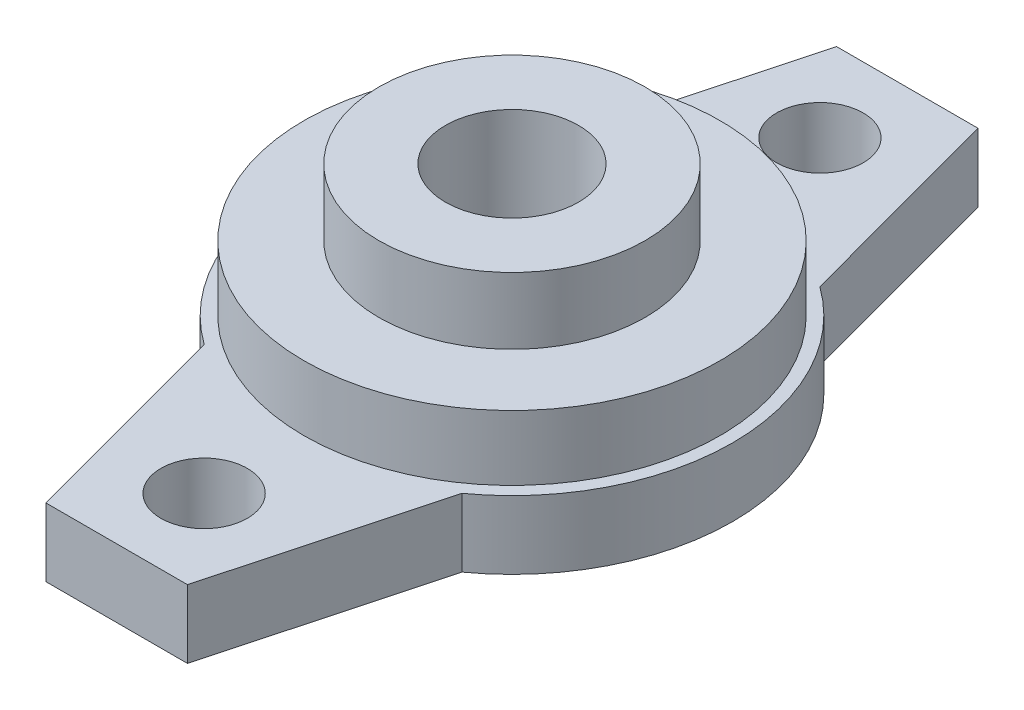
ISO-10303-21;
HEADER;
FILE_DESCRIPTION(('STEP AP214'),'2;1');
FILE_NAME('part.step','',(''),(''),'','','');
FILE_SCHEMA(('AUTOMOTIVE_DESIGN { 1 0 10303 214 1 1 1 1 }'));
ENDSEC;
DATA;
#1=APPLICATION_CONTEXT('core data for automotive mechanical design processes');
#2=APPLICATION_PROTOCOL_DEFINITION('international standard','automotive_design',2000,#1);
#3=PRODUCT_CONTEXT('',#1,'mechanical');
#4=PRODUCT('Part','Part','',(#3));
#5=PRODUCT_RELATED_PRODUCT_CATEGORY('part','',(#4));
#6=PRODUCT_DEFINITION_FORMATION('','',#4);
#7=PRODUCT_DEFINITION_CONTEXT('part definition',#1,'design');
#8=PRODUCT_DEFINITION('design','',#6,#7);
#9=PRODUCT_DEFINITION_SHAPE('','',#8);
#10=(LENGTH_UNIT() NAMED_UNIT(*) SI_UNIT(.MILLI.,.METRE.));
#11=(NAMED_UNIT(*) PLANE_ANGLE_UNIT() SI_UNIT($,.RADIAN.));
#12=(NAMED_UNIT(*) SI_UNIT($,.STERADIAN.) SOLID_ANGLE_UNIT());
#13=UNCERTAINTY_MEASURE_WITH_UNIT(LENGTH_MEASURE(1.E-05),#10,'distance_accuracy_value','');
#14=(GEOMETRIC_REPRESENTATION_CONTEXT(3) GLOBAL_UNCERTAINTY_ASSIGNED_CONTEXT((#13)) GLOBAL_UNIT_ASSIGNED_CONTEXT((#10,
#11,#12)) REPRESENTATION_CONTEXT('',''));
#15=CARTESIAN_POINT('',(0.,0.,0.));
#16=DIRECTION('',(0.,0.,1.));
#17=DIRECTION('',(1.,0.,0.));
#18=AXIS2_PLACEMENT_3D('',#15,#16,#17);
#19=CARTESIAN_POINT('',(0.,4.1,0.));
#20=DIRECTION('',(0.,-1.,0.));
#21=DIRECTION('',(0.,0.,-1.));
#22=AXIS2_PLACEMENT_3D('',#19,#20,#21);
#23=CYLINDRICAL_SURFACE('',#22,13.25);
#24=CARTESIAN_POINT('',(0.,0.,0.));
#25=DIRECTION('',(0.,1.,0.));
#26=DIRECTION('',(0.,0.,1.));
#27=AXIS2_PLACEMENT_3D('',#24,#25,#26);
#28=CIRCLE('',#27,13.25);
#29=CARTESIAN_POINT('',(7.74596669241483,0.,10.75));
#30=VERTEX_POINT('',#29);
#31=CARTESIAN_POINT('',(7.74596669241483,0.,-10.75));
#32=VERTEX_POINT('',#31);
#33=EDGE_CURVE('E137',#30,#32,#28,.T.);
#34=ORIENTED_EDGE('',*,*,#33,.T.);
#35=DIRECTION('',(0.,-1.,0.));
#36=VECTOR('',#35,1.);
#37=CARTESIAN_POINT('',(7.74596669241483,4.1,-10.75));
#38=LINE('',#37,#36);
#39=CARTESIAN_POINT('',(7.74596669241483,4.1,-10.75));
#40=VERTEX_POINT('',#39);
#41=EDGE_CURVE('E169',#40,#32,#38,.T.);
#42=ORIENTED_EDGE('',*,*,#41,.F.);
#43=CARTESIAN_POINT('',(0.,4.1,0.));
#44=DIRECTION('',(0.,1.,0.));
#45=DIRECTION('',(0.,0.,1.));
#46=AXIS2_PLACEMENT_3D('',#43,#44,#45);
#47=CIRCLE('',#46,13.25);
#48=CARTESIAN_POINT('',(7.74596669241483,4.1,10.75));
#49=VERTEX_POINT('',#48);
#50=EDGE_CURVE('E89',#49,#40,#47,.T.);
#51=ORIENTED_EDGE('',*,*,#50,.F.);
#52=DIRECTION('',(0.,-1.,0.));
#53=VECTOR('',#52,1.);
#54=CARTESIAN_POINT('',(7.74596669241483,4.1,10.75));
#55=LINE('',#54,#53);
#56=EDGE_CURVE('E136',#49,#30,#55,.T.);
#57=ORIENTED_EDGE('',*,*,#56,.T.);
#58=EDGE_LOOP('',(#34,#42,#51,#57));
#59=FACE_BOUND('',#58,.T.);
#60=ADVANCED_FACE('F35',(#59),#23,.T.);
#61=CARTESIAN_POINT('',(9.919501317055,4.1,-2.66755740075303));
#62=DIRECTION('',(0.965690930523542,0.,-0.259694102175184));
#63=DIRECTION('',(-0.259694102175184,0.,-0.965690930523542));
#64=AXIS2_PLACEMENT_3D('',#61,#62,#63);
#65=PLANE('',#64);
#66=DIRECTION('',(0.259694102175184,0.,0.965690930523542));
#67=VECTOR('',#66,1.);
#68=CARTESIAN_POINT('',(9.919501317055,0.,-2.66755740075303));
#69=LINE('',#68,#67);
#70=CARTESIAN_POINT('',(4.24999999999999,0.,-23.75));
#71=VERTEX_POINT('',#70);
#72=EDGE_CURVE('E140',#71,#32,#69,.T.);
#73=ORIENTED_EDGE('',*,*,#72,.F.);
#74=DIRECTION('',(0.,-1.,0.));
#75=VECTOR('',#74,1.);
#76=CARTESIAN_POINT('',(4.24999999999999,4.1,-23.75));
#77=LINE('',#76,#75);
#78=CARTESIAN_POINT('',(4.24999999999999,4.1,-23.75));
#79=VERTEX_POINT('',#78);
#80=EDGE_CURVE('E168',#79,#71,#77,.T.);
#81=ORIENTED_EDGE('',*,*,#80,.F.);
#82=DIRECTION('',(0.259694102175184,0.,0.965690930523542));
#83=VECTOR('',#82,1.);
#84=CARTESIAN_POINT('',(9.919501317055,4.1,-2.66755740075303));
#85=LINE('',#84,#83);
#86=EDGE_CURVE('E181',#79,#40,#85,.T.);
#87=ORIENTED_EDGE('',*,*,#86,.T.);
#88=ORIENTED_EDGE('',*,*,#41,.T.);
#89=EDGE_LOOP('',(#73,#81,#87,#88));
#90=FACE_BOUND('',#89,.T.);
#91=ADVANCED_FACE('F37',(#90),#65,.T.);
#92=CARTESIAN_POINT('',(0.,4.1,-23.75));
#93=DIRECTION('',(0.,0.,1.));
#94=DIRECTION('',(1.,0.,0.));
#95=AXIS2_PLACEMENT_3D('',#92,#93,#94);
#96=PLANE('',#95);
#97=DIRECTION('',(-1.,0.,0.));
#98=VECTOR('',#97,1.);
#99=CARTESIAN_POINT('',(0.,0.,-23.75));
#100=LINE('',#99,#98);
#101=CARTESIAN_POINT('',(-4.25,0.,-23.75));
#102=VERTEX_POINT('',#101);
#103=EDGE_CURVE('E145',#71,#102,#100,.T.);
#104=ORIENTED_EDGE('',*,*,#103,.T.);
#105=DIRECTION('',(0.,-1.,0.));
#106=VECTOR('',#105,1.);
#107=CARTESIAN_POINT('',(-4.25,4.1,-23.75));
#108=LINE('',#107,#106);
#109=CARTESIAN_POINT('',(-4.25,4.1,-23.75));
#110=VERTEX_POINT('',#109);
#111=EDGE_CURVE('E165',#110,#102,#108,.T.);
#112=ORIENTED_EDGE('',*,*,#111,.F.);
#113=DIRECTION('',(-1.,0.,0.));
#114=VECTOR('',#113,1.);
#115=CARTESIAN_POINT('',(0.,4.1,-23.75));
#116=LINE('',#115,#114);
#117=EDGE_CURVE('E183',#79,#110,#116,.T.);
#118=ORIENTED_EDGE('',*,*,#117,.F.);
#119=ORIENTED_EDGE('',*,*,#80,.T.);
#120=EDGE_LOOP('',(#104,#112,#118,#119));
#121=FACE_BOUND('',#120,.T.);
#122=ADVANCED_FACE('F221',(#121),#96,.F.);
#123=CARTESIAN_POINT('',(-9.919501317055,4.1,-2.66755740075303));
#124=DIRECTION('',(0.965690930523542,0.,0.259694102175184));
#125=DIRECTION('',(0.259694102175184,0.,-0.965690930523542));
#126=AXIS2_PLACEMENT_3D('',#123,#124,#125);
#127=PLANE('',#126);
#128=DIRECTION('',(-0.259694102175184,0.,0.965690930523542));
#129=VECTOR('',#128,1.);
#130=CARTESIAN_POINT('',(-9.919501317055,0.,-2.66755740075303));
#131=LINE('',#130,#129);
#132=CARTESIAN_POINT('',(-7.74596669241484,0.,-10.75));
#133=VERTEX_POINT('',#132);
#134=EDGE_CURVE('E147',#102,#133,#131,.T.);
#135=ORIENTED_EDGE('',*,*,#134,.T.);
#136=DIRECTION('',(0.,-1.,0.));
#137=VECTOR('',#136,1.);
#138=CARTESIAN_POINT('',(-7.74596669241484,4.1,-10.75));
#139=LINE('',#138,#137);
#140=CARTESIAN_POINT('',(-7.74596669241484,4.1,-10.75));
#141=VERTEX_POINT('',#140);
#142=EDGE_CURVE('E162',#141,#133,#139,.T.);
#143=ORIENTED_EDGE('',*,*,#142,.F.);
#144=DIRECTION('',(-0.259694102175184,0.,0.965690930523542));
#145=VECTOR('',#144,1.);
#146=CARTESIAN_POINT('',(-9.919501317055,4.1,-2.66755740075303));
#147=LINE('',#146,#145);
#148=EDGE_CURVE('E184',#110,#141,#147,.T.);
#149=ORIENTED_EDGE('',*,*,#148,.F.);
#150=ORIENTED_EDGE('',*,*,#111,.T.);
#151=EDGE_LOOP('',(#135,#143,#149,#150));
#152=FACE_BOUND('',#151,.T.);
#153=ADVANCED_FACE('F190',(#152),#127,.F.);
#154=CARTESIAN_POINT('',(-7.74596669241484,0.,10.75));
#155=VERTEX_POINT('',#154);
#156=EDGE_CURVE('E142',#133,#155,#28,.T.);
#157=ORIENTED_EDGE('',*,*,#156,.T.);
#158=DIRECTION('',(0.,-1.,0.));
#159=VECTOR('',#158,1.);
#160=CARTESIAN_POINT('',(-7.74596669241484,4.1,10.75));
#161=LINE('',#160,#159);
#162=CARTESIAN_POINT('',(-7.74596669241484,4.1,10.75));
#163=VERTEX_POINT('',#162);
#164=EDGE_CURVE('E116',#163,#155,#161,.T.);
#165=ORIENTED_EDGE('',*,*,#164,.F.);
#166=EDGE_CURVE('E122',#141,#163,#47,.T.);
#167=ORIENTED_EDGE('',*,*,#166,.F.);
#168=ORIENTED_EDGE('',*,*,#142,.T.);
#169=EDGE_LOOP('',(#157,#165,#167,#168));
#170=FACE_BOUND('',#169,.T.);
#171=ADVANCED_FACE('F195',(#170),#23,.T.);
#172=CARTESIAN_POINT('',(-9.91950131705501,4.1,2.66755740075303));
#173=DIRECTION('',(-0.965690930523542,0.,0.259694102175184));
#174=DIRECTION('',(0.259694102175184,0.,0.965690930523542));
#175=AXIS2_PLACEMENT_3D('',#172,#173,#174);
#176=PLANE('',#175);
#177=DIRECTION('',(-0.259694102175184,0.,-0.965690930523542));
#178=VECTOR('',#177,1.);
#179=CARTESIAN_POINT('',(-9.91950131705501,0.,2.66755740075303));
#180=LINE('',#179,#178);
#181=CARTESIAN_POINT('',(-4.25,0.,23.75));
#182=VERTEX_POINT('',#181);
#183=EDGE_CURVE('E111',#182,#155,#180,.T.);
#184=ORIENTED_EDGE('',*,*,#183,.F.);
#185=DIRECTION('',(0.,-1.,0.));
#186=VECTOR('',#185,1.);
#187=CARTESIAN_POINT('',(-4.25,4.1,23.75));
#188=LINE('',#187,#186);
#189=CARTESIAN_POINT('',(-4.25,4.1,23.75));
#190=VERTEX_POINT('',#189);
#191=EDGE_CURVE('E106',#190,#182,#188,.T.);
#192=ORIENTED_EDGE('',*,*,#191,.F.);
#193=DIRECTION('',(-0.259694102175184,0.,-0.965690930523542));
#194=VECTOR('',#193,1.);
#195=CARTESIAN_POINT('',(-9.91950131705501,4.1,2.66755740075303));
#196=LINE('',#195,#194);
#197=EDGE_CURVE('E109',#190,#163,#196,.T.);
#198=ORIENTED_EDGE('',*,*,#197,.T.);
#199=ORIENTED_EDGE('',*,*,#164,.T.);
#200=EDGE_LOOP('',(#184,#192,#198,#199));
#201=FACE_BOUND('',#200,.T.);
#202=ADVANCED_FACE('F108',(#201),#176,.T.);
#203=CARTESIAN_POINT('',(0.,4.1,23.75));
#204=DIRECTION('',(0.,0.,1.));
#205=DIRECTION('',(1.,0.,0.));
#206=AXIS2_PLACEMENT_3D('',#203,#204,#205);
#207=PLANE('',#206);
#208=DIRECTION('',(-1.,0.,0.));
#209=VECTOR('',#208,1.);
#210=CARTESIAN_POINT('',(0.,0.,23.75));
#211=LINE('',#210,#209);
#212=CARTESIAN_POINT('',(4.24999999999999,0.,23.75));
#213=VERTEX_POINT('',#212);
#214=EDGE_CURVE('E150',#213,#182,#211,.T.);
#215=ORIENTED_EDGE('',*,*,#214,.F.);
#216=DIRECTION('',(0.,-1.,0.));
#217=VECTOR('',#216,1.);
#218=CARTESIAN_POINT('',(4.24999999999999,4.1,23.75));
#219=LINE('',#218,#217);
#220=CARTESIAN_POINT('',(4.24999999999999,4.1,23.75));
#221=VERTEX_POINT('',#220);
#222=EDGE_CURVE('E80',#221,#213,#219,.T.);
#223=ORIENTED_EDGE('',*,*,#222,.F.);
#224=DIRECTION('',(-1.,0.,0.));
#225=VECTOR('',#224,1.);
#226=CARTESIAN_POINT('',(0.,4.1,23.75));
#227=LINE('',#226,#225);
#228=EDGE_CURVE('E120',#221,#190,#227,.T.);
#229=ORIENTED_EDGE('',*,*,#228,.T.);
#230=ORIENTED_EDGE('',*,*,#191,.T.);
#231=EDGE_LOOP('',(#215,#223,#229,#230));
#232=FACE_BOUND('',#231,.T.);
#233=ADVANCED_FACE('F125',(#232),#207,.T.);
#234=CARTESIAN_POINT('',(0.,4.1,-18.5));
#235=DIRECTION('',(0.,-1.,0.));
#236=DIRECTION('',(0.,0.,-1.));
#237=AXIS2_PLACEMENT_3D('',#234,#235,#236);
#238=CYLINDRICAL_SURFACE('',#237,2.6);
#239=CARTESIAN_POINT('',(0.,4.1,-18.5));
#240=DIRECTION('',(0.,1.,0.));
#241=DIRECTION('',(0.,0.,1.));
#242=AXIS2_PLACEMENT_3D('',#239,#240,#241);
#243=CIRCLE('',#242,2.6);
#244=CARTESIAN_POINT('',(0.,4.1,-15.9));
#245=VERTEX_POINT('',#244);
#246=EDGE_CURVE('E127',#245,#245,#243,.T.);
#247=ORIENTED_EDGE('',*,*,#246,.T.);
#248=EDGE_LOOP('',(#247));
#249=FACE_BOUND('',#248,.T.);
#250=CARTESIAN_POINT('',(0.,0.,-18.5));
#251=DIRECTION('',(0.,1.,0.));
#252=DIRECTION('',(0.,0.,1.));
#253=AXIS2_PLACEMENT_3D('',#250,#251,#252);
#254=CIRCLE('',#253,2.6);
#255=CARTESIAN_POINT('',(0.,0.,-15.9));
#256=VERTEX_POINT('',#255);
#257=EDGE_CURVE('E153',#256,#256,#254,.T.);
#258=ORIENTED_EDGE('',*,*,#257,.F.);
#259=EDGE_LOOP('',(#258));
#260=FACE_BOUND('',#259,.T.);
#261=ADVANCED_FACE('F205',(#249,#260),#238,.F.);
#262=CARTESIAN_POINT('',(9.919501317055,4.1,2.66755740075303));
#263=DIRECTION('',(-0.965690930523542,0.,-0.259694102175184));
#264=DIRECTION('',(-0.259694102175184,0.,0.965690930523542));
#265=AXIS2_PLACEMENT_3D('',#262,#263,#264);
#266=PLANE('',#265);
#267=DIRECTION('',(0.259694102175184,0.,-0.965690930523542));
#268=VECTOR('',#267,1.);
#269=CARTESIAN_POINT('',(9.919501317055,0.,2.66755740075303));
#270=LINE('',#269,#268);
#271=EDGE_CURVE('E83',#213,#30,#270,.T.);
#272=ORIENTED_EDGE('',*,*,#271,.T.);
#273=ORIENTED_EDGE('',*,*,#56,.F.);
#274=DIRECTION('',(0.259694102175184,0.,-0.965690930523542));
#275=VECTOR('',#274,1.);
#276=CARTESIAN_POINT('',(9.919501317055,4.1,2.66755740075303));
#277=LINE('',#276,#275);
#278=EDGE_CURVE('E52',#221,#49,#277,.T.);
#279=ORIENTED_EDGE('',*,*,#278,.F.);
#280=ORIENTED_EDGE('',*,*,#222,.T.);
#281=EDGE_LOOP('',(#272,#273,#279,#280));
#282=FACE_BOUND('',#281,.T.);
#283=ADVANCED_FACE('F202',(#282),#266,.F.);
#284=CARTESIAN_POINT('',(0.,4.1,18.5));
#285=DIRECTION('',(0.,-1.,0.));
#286=DIRECTION('',(0.,0.,-1.));
#287=AXIS2_PLACEMENT_3D('',#284,#285,#286);
#288=CYLINDRICAL_SURFACE('',#287,2.6);
#289=CARTESIAN_POINT('',(0.,4.1,18.5));
#290=DIRECTION('',(0.,1.,0.));
#291=DIRECTION('',(0.,0.,1.));
#292=AXIS2_PLACEMENT_3D('',#289,#290,#291);
#293=CIRCLE('',#292,2.6);
#294=CARTESIAN_POINT('',(0.,4.1,21.1));
#295=VERTEX_POINT('',#294);
#296=EDGE_CURVE('E133',#295,#295,#293,.T.);
#297=ORIENTED_EDGE('',*,*,#296,.T.);
#298=EDGE_LOOP('',(#297));
#299=FACE_BOUND('',#298,.T.);
#300=CARTESIAN_POINT('',(0.,0.,18.5));
#301=DIRECTION('',(0.,1.,0.));
#302=DIRECTION('',(0.,0.,1.));
#303=AXIS2_PLACEMENT_3D('',#300,#301,#302);
#304=CIRCLE('',#303,2.6);
#305=CARTESIAN_POINT('',(0.,0.,21.1));
#306=VERTEX_POINT('',#305);
#307=EDGE_CURVE('E156',#306,#306,#304,.T.);
#308=ORIENTED_EDGE('',*,*,#307,.F.);
#309=EDGE_LOOP('',(#308));
#310=FACE_BOUND('',#309,.T.);
#311=ADVANCED_FACE('F204',(#299,#310),#288,.F.);
#312=CARTESIAN_POINT('',(0.,4.1,0.));
#313=DIRECTION('',(0.,1.,0.));
#314=DIRECTION('',(0.,0.,1.));
#315=AXIS2_PLACEMENT_3D('',#312,#313,#314);
#316=PLANE('',#315);
#317=CARTESIAN_POINT('',(0.,4.1,0.));
#318=DIRECTION('',(0.,1.,0.));
#319=DIRECTION('',(0.,0.,1.));
#320=AXIS2_PLACEMENT_3D('',#317,#318,#319);
#321=CIRCLE('',#320,12.5);
#322=CARTESIAN_POINT('',(0.,4.1,12.5));
#323=VERTEX_POINT('',#322);
#324=EDGE_CURVE('E44',#323,#323,#321,.T.);
#325=ORIENTED_EDGE('',*,*,#324,.F.);
#326=EDGE_LOOP('',(#325));
#327=FACE_BOUND('',#326,.T.);
#328=ORIENTED_EDGE('',*,*,#50,.T.);
#329=ORIENTED_EDGE('',*,*,#86,.F.);
#330=ORIENTED_EDGE('',*,*,#117,.T.);
#331=ORIENTED_EDGE('',*,*,#148,.T.);
#332=ORIENTED_EDGE('',*,*,#166,.T.);
#333=ORIENTED_EDGE('',*,*,#197,.F.);
#334=ORIENTED_EDGE('',*,*,#228,.F.);
#335=ORIENTED_EDGE('',*,*,#278,.T.);
#336=EDGE_LOOP('',(#328,#329,#330,#331,#332,#333,#334,#335));
#337=FACE_BOUND('',#336,.T.);
#338=ORIENTED_EDGE('',*,*,#246,.F.);
#339=EDGE_LOOP('',(#338));
#340=FACE_BOUND('',#339,.T.);
#341=ORIENTED_EDGE('',*,*,#296,.F.);
#342=EDGE_LOOP('',(#341));
#343=FACE_BOUND('',#342,.T.);
#344=ADVANCED_FACE('F118',(#327,#337,#340,#343),#316,.T.);
#345=CARTESIAN_POINT('',(0.,0.,0.));
#346=DIRECTION('',(0.,1.,0.));
#347=DIRECTION('',(0.,0.,1.));
#348=AXIS2_PLACEMENT_3D('',#345,#346,#347);
#349=PLANE('',#348);
#350=CARTESIAN_POINT('',(0.,0.,0.));
#351=DIRECTION('',(0.,1.,0.));
#352=DIRECTION('',(0.,0.,1.));
#353=AXIS2_PLACEMENT_3D('',#350,#351,#352);
#354=CIRCLE('',#353,4.);
#355=CARTESIAN_POINT('',(0.,0.,4.));
#356=VERTEX_POINT('',#355);
#357=EDGE_CURVE('E365',#356,#356,#354,.T.);
#358=ORIENTED_EDGE('',*,*,#357,.T.);
#359=EDGE_LOOP('',(#358));
#360=FACE_BOUND('',#359,.T.);
#361=ORIENTED_EDGE('',*,*,#33,.F.);
#362=ORIENTED_EDGE('',*,*,#271,.F.);
#363=ORIENTED_EDGE('',*,*,#214,.T.);
#364=ORIENTED_EDGE('',*,*,#183,.T.);
#365=ORIENTED_EDGE('',*,*,#156,.F.);
#366=ORIENTED_EDGE('',*,*,#134,.F.);
#367=ORIENTED_EDGE('',*,*,#103,.F.);
#368=ORIENTED_EDGE('',*,*,#72,.T.);
#369=EDGE_LOOP('',(#361,#362,#363,#364,#365,#366,#367,#368));
#370=FACE_BOUND('',#369,.T.);
#371=ORIENTED_EDGE('',*,*,#257,.T.);
#372=EDGE_LOOP('',(#371));
#373=FACE_BOUND('',#372,.T.);
#374=ORIENTED_EDGE('',*,*,#307,.T.);
#375=EDGE_LOOP('',(#374));
#376=FACE_BOUND('',#375,.T.);
#377=ADVANCED_FACE('F198',(#360,#370,#373,#376),#349,.F.);
#378=CARTESIAN_POINT('',(0.,0.,0.));
#379=DIRECTION('',(0.,1.,0.));
#380=DIRECTION('',(0.,0.,1.));
#381=AXIS2_PLACEMENT_3D('',#378,#379,#380);
#382=CYLINDRICAL_SURFACE('',#381,12.5);
#383=ORIENTED_EDGE('',*,*,#324,.T.);
#384=EDGE_LOOP('',(#383));
#385=FACE_BOUND('',#384,.T.);
#386=CARTESIAN_POINT('',(0.,8.,0.));
#387=DIRECTION('',(0.,1.,0.));
#388=DIRECTION('',(0.,0.,1.));
#389=AXIS2_PLACEMENT_3D('',#386,#387,#388);
#390=CIRCLE('',#389,12.5);
#391=CARTESIAN_POINT('',(0.,8.,12.5));
#392=VERTEX_POINT('',#391);
#393=EDGE_CURVE('E141',#392,#392,#390,.T.);
#394=ORIENTED_EDGE('',*,*,#393,.F.);
#395=EDGE_LOOP('',(#394));
#396=FACE_BOUND('',#395,.T.);
#397=ADVANCED_FACE('F302',(#385,#396),#382,.T.);
#398=CARTESIAN_POINT('',(0.,8.,0.));
#399=DIRECTION('',(0.,1.,0.));
#400=DIRECTION('',(0.,0.,1.));
#401=AXIS2_PLACEMENT_3D('',#398,#399,#400);
#402=PLANE('',#401);
#403=CARTESIAN_POINT('',(0.,8.,0.));
#404=DIRECTION('',(0.,1.,0.));
#405=DIRECTION('',(0.,0.,1.));
#406=AXIS2_PLACEMENT_3D('',#403,#404,#405);
#407=CIRCLE('',#406,8.);
#408=CARTESIAN_POINT('',(0.,8.,8.));
#409=VERTEX_POINT('',#408);
#410=EDGE_CURVE('E11',#409,#409,#407,.T.);
#411=ORIENTED_EDGE('',*,*,#410,.F.);
#412=EDGE_LOOP('',(#411));
#413=FACE_BOUND('',#412,.T.);
#414=ORIENTED_EDGE('',*,*,#393,.T.);
#415=EDGE_LOOP('',(#414));
#416=FACE_BOUND('',#415,.T.);
#417=ADVANCED_FACE('F319',(#413,#416),#402,.T.);
#418=CARTESIAN_POINT('',(0.,4.1,0.));
#419=DIRECTION('',(0.,1.,0.));
#420=DIRECTION('',(0.,0.,1.));
#421=AXIS2_PLACEMENT_3D('',#418,#419,#420);
#422=CYLINDRICAL_SURFACE('',#421,8.);
#423=ORIENTED_EDGE('',*,*,#410,.T.);
#424=EDGE_LOOP('',(#423));
#425=FACE_BOUND('',#424,.T.);
#426=CARTESIAN_POINT('',(0.,12.,0.));
#427=DIRECTION('',(0.,1.,0.));
#428=DIRECTION('',(0.,0.,1.));
#429=AXIS2_PLACEMENT_3D('',#426,#427,#428);
#430=CIRCLE('',#429,8.);
#431=CARTESIAN_POINT('',(0.,12.,8.));
#432=VERTEX_POINT('',#431);
#433=EDGE_CURVE('E370',#432,#432,#430,.T.);
#434=ORIENTED_EDGE('',*,*,#433,.F.);
#435=EDGE_LOOP('',(#434));
#436=FACE_BOUND('',#435,.T.);
#437=ADVANCED_FACE('F327',(#425,#436),#422,.T.);
#438=CARTESIAN_POINT('',(0.,12.,0.));
#439=DIRECTION('',(0.,1.,0.));
#440=DIRECTION('',(0.,0.,1.));
#441=AXIS2_PLACEMENT_3D('',#438,#439,#440);
#442=PLANE('',#441);
#443=CARTESIAN_POINT('',(0.,12.,0.));
#444=DIRECTION('',(0.,1.,0.));
#445=DIRECTION('',(0.,0.,1.));
#446=AXIS2_PLACEMENT_3D('',#443,#444,#445);
#447=CIRCLE('',#446,4.);
#448=CARTESIAN_POINT('',(0.,12.,4.));
#449=VERTEX_POINT('',#448);
#450=EDGE_CURVE('E368',#449,#449,#447,.T.);
#451=ORIENTED_EDGE('',*,*,#450,.F.);
#452=EDGE_LOOP('',(#451));
#453=FACE_BOUND('',#452,.T.);
#454=ORIENTED_EDGE('',*,*,#433,.T.);
#455=EDGE_LOOP('',(#454));
#456=FACE_BOUND('',#455,.T.);
#457=ADVANCED_FACE('F335',(#453,#456),#442,.T.);
#458=CARTESIAN_POINT('',(0.,0.,0.));
#459=DIRECTION('',(0.,1.,0.));
#460=DIRECTION('',(0.,0.,1.));
#461=AXIS2_PLACEMENT_3D('',#458,#459,#460);
#462=CYLINDRICAL_SURFACE('',#461,4.);
#463=ORIENTED_EDGE('',*,*,#357,.F.);
#464=EDGE_LOOP('',(#463));
#465=FACE_BOUND('',#464,.T.);
#466=ORIENTED_EDGE('',*,*,#450,.T.);
#467=EDGE_LOOP('',(#466));
#468=FACE_BOUND('',#467,.T.);
#469=ADVANCED_FACE('F343',(#465,#468),#462,.F.);
#470=CLOSED_SHELL('',(#60,#91,#122,#153,#171,#202,#233,#261,#283,#311,#344,#377,#397,#417,#437,
#457,#469));
#471=MANIFOLD_SOLID_BREP('B2',#470);
#472=ADVANCED_BREP_SHAPE_REPRESENTATION('',(#18,#471),#14);
#473=SHAPE_DEFINITION_REPRESENTATION(#9,#472);
ENDSEC;
END-ISO-10303-21;
